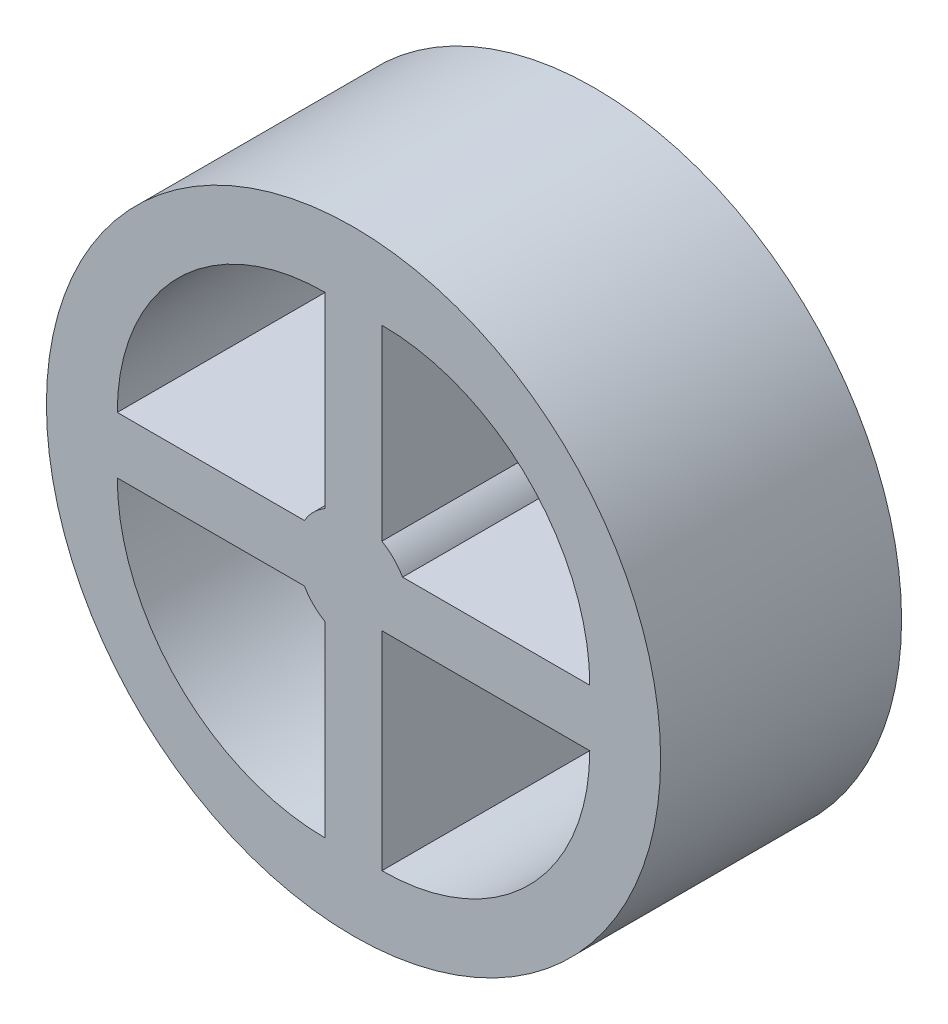
ISO-10303-21;
HEADER;
FILE_DESCRIPTION(('STEP AP214'),'2;1');
FILE_NAME('part.step','',(''),(''),'','','');
FILE_SCHEMA(('AUTOMOTIVE_DESIGN { 1 0 10303 214 1 1 1 1 }'));
ENDSEC;
DATA;
#1=APPLICATION_CONTEXT('core data for automotive mechanical design processes');
#2=APPLICATION_PROTOCOL_DEFINITION('international standard','automotive_design',2000,#1);
#3=PRODUCT_CONTEXT('',#1,'mechanical');
#4=PRODUCT('Part','Part','',(#3));
#5=PRODUCT_RELATED_PRODUCT_CATEGORY('part','',(#4));
#6=PRODUCT_DEFINITION_FORMATION('','',#4);
#7=PRODUCT_DEFINITION_CONTEXT('part definition',#1,'design');
#8=PRODUCT_DEFINITION('design','',#6,#7);
#9=PRODUCT_DEFINITION_SHAPE('','',#8);
#10=(LENGTH_UNIT() NAMED_UNIT(*) SI_UNIT(.MILLI.,.METRE.));
#11=(NAMED_UNIT(*) PLANE_ANGLE_UNIT() SI_UNIT($,.RADIAN.));
#12=(NAMED_UNIT(*) SI_UNIT($,.STERADIAN.) SOLID_ANGLE_UNIT());
#13=UNCERTAINTY_MEASURE_WITH_UNIT(LENGTH_MEASURE(1.E-05),#10,'distance_accuracy_value','');
#14=(GEOMETRIC_REPRESENTATION_CONTEXT(3) GLOBAL_UNCERTAINTY_ASSIGNED_CONTEXT((#13)) GLOBAL_UNIT_ASSIGNED_CONTEXT((#10,
#11,#12)) REPRESENTATION_CONTEXT('',''));
#15=CARTESIAN_POINT('',(0.,0.,0.));
#16=DIRECTION('',(0.,0.,1.));
#17=DIRECTION('',(1.,0.,0.));
#18=AXIS2_PLACEMENT_3D('',#15,#16,#17);
#19=CARTESIAN_POINT('',(0.,0.,255.));
#20=DIRECTION('',(0.,0.,1.));
#21=DIRECTION('',(1.,0.,0.));
#22=AXIS2_PLACEMENT_3D('',#19,#20,#21);
#23=PLANE('',#22);
#24=CARTESIAN_POINT('',(0.,0.,255.));
#25=DIRECTION('',(0.,0.,1.));
#26=DIRECTION('',(1.,0.,0.));
#27=AXIS2_PLACEMENT_3D('',#24,#25,#26);
#28=CIRCLE('',#27,325.);
#29=CARTESIAN_POINT('',(325.,0.,255.));
#30=VERTEX_POINT('',#29);
#31=EDGE_CURVE('E11',#30,#30,#28,.T.);
#32=ORIENTED_EDGE('',*,*,#31,.T.);
#33=EDGE_LOOP('',(#32));
#34=FACE_BOUND('',#33,.T.);
#35=DIRECTION('',(0.,-1.,0.));
#36=VECTOR('',#35,1.);
#37=CARTESIAN_POINT('',(30.,250.,255.));
#38=LINE('',#37,#36);
#39=CARTESIAN_POINT('',(30.,250.,255.));
#40=VERTEX_POINT('',#39);
#41=CARTESIAN_POINT('',(30.,51.9615242270663,255.));
#42=VERTEX_POINT('',#41);
#43=EDGE_CURVE('E231',#40,#42,#38,.T.);
#44=ORIENTED_EDGE('',*,*,#43,.F.);
#45=CARTESIAN_POINT('',(30.,30.,255.));
#46=DIRECTION('',(0.,0.,1.));
#47=DIRECTION('',(-1.,0.,0.));
#48=AXIS2_PLACEMENT_3D('',#45,#46,#47);
#49=CIRCLE('',#48,220.);
#50=CARTESIAN_POINT('',(250.,30.,255.));
#51=VERTEX_POINT('',#50);
#52=EDGE_CURVE('E229',#51,#40,#49,.T.);
#53=ORIENTED_EDGE('',*,*,#52,.F.);
#54=DIRECTION('',(1.,0.,0.));
#55=VECTOR('',#54,1.);
#56=CARTESIAN_POINT('',(51.9615242270663,30.,255.));
#57=LINE('',#56,#55);
#58=CARTESIAN_POINT('',(51.9615242270663,30.,255.));
#59=VERTEX_POINT('',#58);
#60=EDGE_CURVE('E237',#59,#51,#57,.T.);
#61=ORIENTED_EDGE('',*,*,#60,.F.);
#62=CARTESIAN_POINT('',(0.,0.,255.));
#63=DIRECTION('',(0.,0.,-1.));
#64=DIRECTION('',(1.,0.,0.));
#65=AXIS2_PLACEMENT_3D('',#62,#63,#64);
#66=CIRCLE('',#65,60.);
#67=EDGE_CURVE('E234',#42,#59,#66,.T.);
#68=ORIENTED_EDGE('',*,*,#67,.F.);
#69=EDGE_LOOP('',(#44,#53,#61,#68));
#70=FACE_BOUND('',#69,.T.);
#71=DIRECTION('',(0.,1.,0.));
#72=VECTOR('',#71,1.);
#73=CARTESIAN_POINT('',(-30.,250.,255.));
#74=LINE('',#73,#72);
#75=CARTESIAN_POINT('',(-30.,51.9615242270663,255.));
#76=VERTEX_POINT('',#75);
#77=CARTESIAN_POINT('',(-30.,250.,255.));
#78=VERTEX_POINT('',#77);
#79=EDGE_CURVE('E200',#76,#78,#74,.T.);
#80=ORIENTED_EDGE('',*,*,#79,.F.);
#81=CARTESIAN_POINT('',(0.,0.,255.));
#82=DIRECTION('',(0.,0.,-1.));
#83=DIRECTION('',(1.,0.,0.));
#84=AXIS2_PLACEMENT_3D('',#81,#82,#83);
#85=CIRCLE('',#84,60.);
#86=CARTESIAN_POINT('',(-51.9615242270663,30.,255.));
#87=VERTEX_POINT('',#86);
#88=EDGE_CURVE('E198',#87,#76,#85,.T.);
#89=ORIENTED_EDGE('',*,*,#88,.F.);
#90=DIRECTION('',(1.,0.,0.));
#91=VECTOR('',#90,1.);
#92=CARTESIAN_POINT('',(-51.9615242270663,30.,255.));
#93=LINE('',#92,#91);
#94=CARTESIAN_POINT('',(-250.,30.,255.));
#95=VERTEX_POINT('',#94);
#96=EDGE_CURVE('E206',#95,#87,#93,.T.);
#97=ORIENTED_EDGE('',*,*,#96,.F.);
#98=CARTESIAN_POINT('',(-30.,30.,255.));
#99=DIRECTION('',(0.,0.,1.));
#100=DIRECTION('',(1.,0.,0.));
#101=AXIS2_PLACEMENT_3D('',#98,#99,#100);
#102=CIRCLE('',#101,220.);
#103=EDGE_CURVE('E203',#78,#95,#102,.T.);
#104=ORIENTED_EDGE('',*,*,#103,.F.);
#105=EDGE_LOOP('',(#80,#89,#97,#104));
#106=FACE_BOUND('',#105,.T.);
#107=DIRECTION('',(0.,1.,0.));
#108=VECTOR('',#107,1.);
#109=CARTESIAN_POINT('',(-30.0000000000001,-51.9615242270663,255.));
#110=LINE('',#109,#108);
#111=CARTESIAN_POINT('',(-30.,-250.,255.));
#112=VERTEX_POINT('',#111);
#113=CARTESIAN_POINT('',(-30.0000000000001,-51.9615242270663,255.));
#114=VERTEX_POINT('',#113);
#115=EDGE_CURVE('E169',#112,#114,#110,.T.);
#116=ORIENTED_EDGE('',*,*,#115,.F.);
#117=CARTESIAN_POINT('',(-30.0000000000001,-30.,255.));
#118=DIRECTION('',(0.,0.,1.));
#119=DIRECTION('',(-1.,0.,0.));
#120=AXIS2_PLACEMENT_3D('',#117,#118,#119);
#121=CIRCLE('',#120,220.);
#122=CARTESIAN_POINT('',(-250.,-30.,255.));
#123=VERTEX_POINT('',#122);
#124=EDGE_CURVE('E167',#123,#112,#121,.T.);
#125=ORIENTED_EDGE('',*,*,#124,.F.);
#126=DIRECTION('',(-1.,0.,0.));
#127=VECTOR('',#126,1.);
#128=CARTESIAN_POINT('',(-250.,-30.,255.));
#129=LINE('',#128,#127);
#130=CARTESIAN_POINT('',(-51.9615242270663,-30.,255.));
#131=VERTEX_POINT('',#130);
#132=EDGE_CURVE('E175',#131,#123,#129,.T.);
#133=ORIENTED_EDGE('',*,*,#132,.F.);
#134=CARTESIAN_POINT('',(0.,0.,255.));
#135=DIRECTION('',(0.,0.,-1.));
#136=DIRECTION('',(1.,0.,0.));
#137=AXIS2_PLACEMENT_3D('',#134,#135,#136);
#138=CIRCLE('',#137,60.);
#139=EDGE_CURVE('E172',#114,#131,#138,.T.);
#140=ORIENTED_EDGE('',*,*,#139,.F.);
#141=EDGE_LOOP('',(#116,#125,#133,#140));
#142=FACE_BOUND('',#141,.T.);
#143=CARTESIAN_POINT('',(30.0000000000006,-30.0000000000006,255.));
#144=DIRECTION('',(0.,0.,1.));
#145=DIRECTION('',(-1.,0.,0.));
#146=AXIS2_PLACEMENT_3D('',#143,#144,#145);
#147=CIRCLE('',#146,220.);
#148=CARTESIAN_POINT('',(30.0000000000006,-250.,255.));
#149=VERTEX_POINT('',#148);
#150=CARTESIAN_POINT('',(250.000000000001,-30.,255.));
#151=VERTEX_POINT('',#150);
#152=EDGE_CURVE('E148',#149,#151,#147,.T.);
#153=ORIENTED_EDGE('',*,*,#152,.F.);
#154=DIRECTION('',(0.,-1.,0.));
#155=VECTOR('',#154,1.);
#156=CARTESIAN_POINT('',(30.0000000000006,-30.0000000000006,255.));
#157=LINE('',#156,#155);
#158=CARTESIAN_POINT('',(30.0000000000006,-30.0000000000006,255.));
#159=VERTEX_POINT('',#158);
#160=EDGE_CURVE('E140',#159,#149,#157,.T.);
#161=ORIENTED_EDGE('',*,*,#160,.F.);
#162=DIRECTION('',(-1.,0.,0.));
#163=VECTOR('',#162,1.);
#164=CARTESIAN_POINT('',(30.0000000000006,-30.0000000000006,255.));
#165=LINE('',#164,#163);
#166=EDGE_CURVE('E157',#151,#159,#165,.T.);
#167=ORIENTED_EDGE('',*,*,#166,.F.);
#168=EDGE_LOOP('',(#153,#161,#167));
#169=FACE_BOUND('',#168,.T.);
#170=ADVANCED_FACE('F33',(#34,#70,#106,#142,#169),#23,.T.);
#171=CARTESIAN_POINT('',(0.,0.,0.));
#172=DIRECTION('',(0.,0.,1.));
#173=DIRECTION('',(1.,0.,0.));
#174=AXIS2_PLACEMENT_3D('',#171,#172,#173);
#175=PLANE('',#174);
#176=CARTESIAN_POINT('',(-30.0000000000001,-30.,0.));
#177=DIRECTION('',(0.,0.,1.));
#178=DIRECTION('',(-1.,0.,0.));
#179=AXIS2_PLACEMENT_3D('',#176,#177,#178);
#180=CIRCLE('',#179,220.);
#181=CARTESIAN_POINT('',(-250.,-30.,0.));
#182=VERTEX_POINT('',#181);
#183=CARTESIAN_POINT('',(-30.,-250.,0.));
#184=VERTEX_POINT('',#183);
#185=EDGE_CURVE('E155',#182,#184,#180,.T.);
#186=ORIENTED_EDGE('',*,*,#185,.T.);
#187=DIRECTION('',(0.,1.,0.));
#188=VECTOR('',#187,1.);
#189=CARTESIAN_POINT('',(-30.0000000000001,-51.9615242270663,0.));
#190=LINE('',#189,#188);
#191=CARTESIAN_POINT('',(-30.0000000000001,-51.9615242270663,0.));
#192=VERTEX_POINT('',#191);
#193=EDGE_CURVE('E180',#184,#192,#190,.T.);
#194=ORIENTED_EDGE('',*,*,#193,.T.);
#195=CARTESIAN_POINT('',(0.,0.,0.));
#196=DIRECTION('',(0.,0.,-1.));
#197=DIRECTION('',(1.,0.,0.));
#198=AXIS2_PLACEMENT_3D('',#195,#196,#197);
#199=CIRCLE('',#198,60.);
#200=CARTESIAN_POINT('',(-51.9615242270663,-30.,0.));
#201=VERTEX_POINT('',#200);
#202=EDGE_CURVE('E183',#192,#201,#199,.T.);
#203=ORIENTED_EDGE('',*,*,#202,.T.);
#204=DIRECTION('',(-1.,0.,0.));
#205=VECTOR('',#204,1.);
#206=CARTESIAN_POINT('',(-250.,-30.,0.));
#207=LINE('',#206,#205);
#208=EDGE_CURVE('E170',#201,#182,#207,.T.);
#209=ORIENTED_EDGE('',*,*,#208,.T.);
#210=EDGE_LOOP('',(#186,#194,#203,#209));
#211=FACE_BOUND('',#210,.T.);
#212=CARTESIAN_POINT('',(30.,30.,0.));
#213=DIRECTION('',(0.,0.,1.));
#214=DIRECTION('',(-1.,0.,0.));
#215=AXIS2_PLACEMENT_3D('',#212,#213,#214);
#216=CIRCLE('',#215,220.);
#217=CARTESIAN_POINT('',(250.,30.,0.));
#218=VERTEX_POINT('',#217);
#219=CARTESIAN_POINT('',(30.,250.,0.));
#220=VERTEX_POINT('',#219);
#221=EDGE_CURVE('E228',#218,#220,#216,.T.);
#222=ORIENTED_EDGE('',*,*,#221,.T.);
#223=DIRECTION('',(0.,-1.,0.));
#224=VECTOR('',#223,1.);
#225=CARTESIAN_POINT('',(30.,250.,0.));
#226=LINE('',#225,#224);
#227=CARTESIAN_POINT('',(30.,51.9615242270663,0.));
#228=VERTEX_POINT('',#227);
#229=EDGE_CURVE('E242',#220,#228,#226,.T.);
#230=ORIENTED_EDGE('',*,*,#229,.T.);
#231=CARTESIAN_POINT('',(0.,0.,0.));
#232=DIRECTION('',(0.,0.,-1.));
#233=DIRECTION('',(1.,0.,0.));
#234=AXIS2_PLACEMENT_3D('',#231,#232,#233);
#235=CIRCLE('',#234,60.);
#236=CARTESIAN_POINT('',(51.9615242270663,30.,0.));
#237=VERTEX_POINT('',#236);
#238=EDGE_CURVE('E245',#228,#237,#235,.T.);
#239=ORIENTED_EDGE('',*,*,#238,.T.);
#240=DIRECTION('',(1.,0.,0.));
#241=VECTOR('',#240,1.);
#242=CARTESIAN_POINT('',(51.9615242270663,30.,0.));
#243=LINE('',#242,#241);
#244=EDGE_CURVE('E232',#237,#218,#243,.T.);
#245=ORIENTED_EDGE('',*,*,#244,.T.);
#246=EDGE_LOOP('',(#222,#230,#239,#245));
#247=FACE_BOUND('',#246,.T.);
#248=CARTESIAN_POINT('',(0.,0.,0.));
#249=DIRECTION('',(0.,0.,1.));
#250=DIRECTION('',(1.,0.,0.));
#251=AXIS2_PLACEMENT_3D('',#248,#249,#250);
#252=CIRCLE('',#251,325.);
#253=CARTESIAN_POINT('',(325.,0.,0.));
#254=VERTEX_POINT('',#253);
#255=EDGE_CURVE('E37',#254,#254,#252,.T.);
#256=ORIENTED_EDGE('',*,*,#255,.F.);
#257=EDGE_LOOP('',(#256));
#258=FACE_BOUND('',#257,.T.);
#259=CARTESIAN_POINT('',(0.,0.,0.));
#260=DIRECTION('',(0.,0.,-1.));
#261=DIRECTION('',(1.,0.,0.));
#262=AXIS2_PLACEMENT_3D('',#259,#260,#261);
#263=CIRCLE('',#262,60.);
#264=CARTESIAN_POINT('',(-51.9615242270663,30.,0.));
#265=VERTEX_POINT('',#264);
#266=CARTESIAN_POINT('',(-30.,51.9615242270663,0.));
#267=VERTEX_POINT('',#266);
#268=EDGE_CURVE('E197',#265,#267,#263,.T.);
#269=ORIENTED_EDGE('',*,*,#268,.T.);
#270=DIRECTION('',(0.,1.,0.));
#271=VECTOR('',#270,1.);
#272=CARTESIAN_POINT('',(-30.,250.,0.));
#273=LINE('',#272,#271);
#274=CARTESIAN_POINT('',(-30.,250.,0.));
#275=VERTEX_POINT('',#274);
#276=EDGE_CURVE('E211',#267,#275,#273,.T.);
#277=ORIENTED_EDGE('',*,*,#276,.T.);
#278=CARTESIAN_POINT('',(-30.,30.,0.));
#279=DIRECTION('',(0.,0.,1.));
#280=DIRECTION('',(1.,0.,0.));
#281=AXIS2_PLACEMENT_3D('',#278,#279,#280);
#282=CIRCLE('',#281,220.);
#283=CARTESIAN_POINT('',(-250.,30.,0.));
#284=VERTEX_POINT('',#283);
#285=EDGE_CURVE('E214',#275,#284,#282,.T.);
#286=ORIENTED_EDGE('',*,*,#285,.T.);
#287=DIRECTION('',(1.,0.,0.));
#288=VECTOR('',#287,1.);
#289=CARTESIAN_POINT('',(-51.9615242270663,30.,0.));
#290=LINE('',#289,#288);
#291=EDGE_CURVE('E201',#284,#265,#290,.T.);
#292=ORIENTED_EDGE('',*,*,#291,.T.);
#293=EDGE_LOOP('',(#269,#277,#286,#292));
#294=FACE_BOUND('',#293,.T.);
#295=DIRECTION('',(0.,-1.,0.));
#296=VECTOR('',#295,1.);
#297=CARTESIAN_POINT('',(30.0000000000006,-30.0000000000006,0.));
#298=LINE('',#297,#296);
#299=CARTESIAN_POINT('',(30.0000000000006,-30.0000000000006,0.));
#300=VERTEX_POINT('',#299);
#301=CARTESIAN_POINT('',(30.0000000000006,-250.,0.));
#302=VERTEX_POINT('',#301);
#303=EDGE_CURVE('E56',#300,#302,#298,.T.);
#304=ORIENTED_EDGE('',*,*,#303,.T.);
#305=CARTESIAN_POINT('',(30.0000000000006,-30.0000000000006,0.));
#306=DIRECTION('',(0.,0.,1.));
#307=DIRECTION('',(-1.,0.,0.));
#308=AXIS2_PLACEMENT_3D('',#305,#306,#307);
#309=CIRCLE('',#308,220.);
#310=CARTESIAN_POINT('',(250.000000000001,-30.,0.));
#311=VERTEX_POINT('',#310);
#312=EDGE_CURVE('E154',#302,#311,#309,.T.);
#313=ORIENTED_EDGE('',*,*,#312,.T.);
#314=DIRECTION('',(-1.,0.,0.));
#315=VECTOR('',#314,1.);
#316=CARTESIAN_POINT('',(30.0000000000006,-30.0000000000006,0.));
#317=LINE('',#316,#315);
#318=EDGE_CURVE('E149',#311,#300,#317,.T.);
#319=ORIENTED_EDGE('',*,*,#318,.T.);
#320=EDGE_LOOP('',(#304,#313,#319));
#321=FACE_BOUND('',#320,.T.);
#322=ADVANCED_FACE('F264',(#211,#247,#258,#294,#321),#175,.F.);
#323=CARTESIAN_POINT('',(0.,0.,255.));
#324=DIRECTION('',(0.,0.,-1.));
#325=DIRECTION('',(-1.,0.,0.));
#326=AXIS2_PLACEMENT_3D('',#323,#324,#325);
#327=CYLINDRICAL_SURFACE('',#326,325.);
#328=ORIENTED_EDGE('',*,*,#31,.F.);
#329=EDGE_LOOP('',(#328));
#330=FACE_BOUND('',#329,.T.);
#331=ORIENTED_EDGE('',*,*,#255,.T.);
#332=EDGE_LOOP('',(#331));
#333=FACE_BOUND('',#332,.T.);
#334=ADVANCED_FACE('F35',(#330,#333),#327,.T.);
#335=CARTESIAN_POINT('',(30.,30.,255.));
#336=DIRECTION('',(0.,0.,-1.));
#337=DIRECTION('',(-1.,0.,0.));
#338=AXIS2_PLACEMENT_3D('',#335,#336,#337);
#339=CYLINDRICAL_SURFACE('',#338,220.);
#340=ORIENTED_EDGE('',*,*,#221,.F.);
#341=DIRECTION('',(0.,0.,-1.));
#342=VECTOR('',#341,1.);
#343=CARTESIAN_POINT('',(250.,30.,255.));
#344=LINE('',#343,#342);
#345=EDGE_CURVE('E239',#51,#218,#344,.T.);
#346=ORIENTED_EDGE('',*,*,#345,.F.);
#347=ORIENTED_EDGE('',*,*,#52,.T.);
#348=DIRECTION('',(0.,0.,-1.));
#349=VECTOR('',#348,1.);
#350=CARTESIAN_POINT('',(30.,250.,255.));
#351=LINE('',#350,#349);
#352=EDGE_CURVE('E256',#40,#220,#351,.T.);
#353=ORIENTED_EDGE('',*,*,#352,.T.);
#354=EDGE_LOOP('',(#340,#346,#347,#353));
#355=FACE_BOUND('',#354,.T.);
#356=ADVANCED_FACE('F283',(#355),#339,.F.);
#357=CARTESIAN_POINT('',(30.,250.,255.));
#358=DIRECTION('',(1.,0.,0.));
#359=DIRECTION('',(0.,1.,0.));
#360=AXIS2_PLACEMENT_3D('',#357,#358,#359);
#361=PLANE('',#360);
#362=ORIENTED_EDGE('',*,*,#229,.F.);
#363=ORIENTED_EDGE('',*,*,#352,.F.);
#364=ORIENTED_EDGE('',*,*,#43,.T.);
#365=DIRECTION('',(0.,0.,-1.));
#366=VECTOR('',#365,1.);
#367=CARTESIAN_POINT('',(30.,51.9615242270663,255.));
#368=LINE('',#367,#366);
#369=EDGE_CURVE('E254',#42,#228,#368,.T.);
#370=ORIENTED_EDGE('',*,*,#369,.T.);
#371=EDGE_LOOP('',(#362,#363,#364,#370));
#372=FACE_BOUND('',#371,.T.);
#373=ADVANCED_FACE('F286',(#372),#361,.T.);
#374=CARTESIAN_POINT('',(0.,0.,255.));
#375=DIRECTION('',(0.,0.,-1.));
#376=DIRECTION('',(-1.,0.,0.));
#377=AXIS2_PLACEMENT_3D('',#374,#375,#376);
#378=CYLINDRICAL_SURFACE('',#377,60.);
#379=ORIENTED_EDGE('',*,*,#238,.F.);
#380=ORIENTED_EDGE('',*,*,#369,.F.);
#381=ORIENTED_EDGE('',*,*,#67,.T.);
#382=DIRECTION('',(0.,0.,-1.));
#383=VECTOR('',#382,1.);
#384=CARTESIAN_POINT('',(51.9615242270663,30.,255.));
#385=LINE('',#384,#383);
#386=EDGE_CURVE('E252',#59,#237,#385,.T.);
#387=ORIENTED_EDGE('',*,*,#386,.T.);
#388=EDGE_LOOP('',(#379,#380,#381,#387));
#389=FACE_BOUND('',#388,.T.);
#390=ADVANCED_FACE('F289',(#389),#378,.T.);
#391=CARTESIAN_POINT('',(51.9615242270663,30.,255.));
#392=DIRECTION('',(0.,1.,0.));
#393=DIRECTION('',(-1.,0.,0.));
#394=AXIS2_PLACEMENT_3D('',#391,#392,#393);
#395=PLANE('',#394);
#396=ORIENTED_EDGE('',*,*,#244,.F.);
#397=ORIENTED_EDGE('',*,*,#386,.F.);
#398=ORIENTED_EDGE('',*,*,#60,.T.);
#399=ORIENTED_EDGE('',*,*,#345,.T.);
#400=EDGE_LOOP('',(#396,#397,#398,#399));
#401=FACE_BOUND('',#400,.T.);
#402=ADVANCED_FACE('F293',(#401),#395,.T.);
#403=CARTESIAN_POINT('',(0.,0.,255.));
#404=DIRECTION('',(0.,0.,-1.));
#405=DIRECTION('',(-1.,0.,0.));
#406=AXIS2_PLACEMENT_3D('',#403,#404,#405);
#407=CYLINDRICAL_SURFACE('',#406,60.);
#408=ORIENTED_EDGE('',*,*,#268,.F.);
#409=DIRECTION('',(0.,0.,-1.));
#410=VECTOR('',#409,1.);
#411=CARTESIAN_POINT('',(-51.9615242270663,30.,255.));
#412=LINE('',#411,#410);
#413=EDGE_CURVE('E208',#87,#265,#412,.T.);
#414=ORIENTED_EDGE('',*,*,#413,.F.);
#415=ORIENTED_EDGE('',*,*,#88,.T.);
#416=DIRECTION('',(0.,0.,-1.));
#417=VECTOR('',#416,1.);
#418=CARTESIAN_POINT('',(-30.,51.9615242270663,255.));
#419=LINE('',#418,#417);
#420=EDGE_CURVE('E225',#76,#267,#419,.T.);
#421=ORIENTED_EDGE('',*,*,#420,.T.);
#422=EDGE_LOOP('',(#408,#414,#415,#421));
#423=FACE_BOUND('',#422,.T.);
#424=ADVANCED_FACE('F297',(#423),#407,.T.);
#425=CARTESIAN_POINT('',(-30.,250.,255.));
#426=DIRECTION('',(-1.,0.,0.));
#427=DIRECTION('',(0.,-1.,0.));
#428=AXIS2_PLACEMENT_3D('',#425,#426,#427);
#429=PLANE('',#428);
#430=ORIENTED_EDGE('',*,*,#276,.F.);
#431=ORIENTED_EDGE('',*,*,#420,.F.);
#432=ORIENTED_EDGE('',*,*,#79,.T.);
#433=DIRECTION('',(0.,0.,-1.));
#434=VECTOR('',#433,1.);
#435=CARTESIAN_POINT('',(-30.,250.,255.));
#436=LINE('',#435,#434);
#437=EDGE_CURVE('E223',#78,#275,#436,.T.);
#438=ORIENTED_EDGE('',*,*,#437,.T.);
#439=EDGE_LOOP('',(#430,#431,#432,#438));
#440=FACE_BOUND('',#439,.T.);
#441=ADVANCED_FACE('F301',(#440),#429,.T.);
#442=CARTESIAN_POINT('',(-30.,30.,255.));
#443=DIRECTION('',(0.,0.,-1.));
#444=DIRECTION('',(-1.,0.,0.));
#445=AXIS2_PLACEMENT_3D('',#442,#443,#444);
#446=CYLINDRICAL_SURFACE('',#445,220.);
#447=ORIENTED_EDGE('',*,*,#285,.F.);
#448=ORIENTED_EDGE('',*,*,#437,.F.);
#449=ORIENTED_EDGE('',*,*,#103,.T.);
#450=DIRECTION('',(0.,0.,-1.));
#451=VECTOR('',#450,1.);
#452=CARTESIAN_POINT('',(-250.,30.,255.));
#453=LINE('',#452,#451);
#454=EDGE_CURVE('E221',#95,#284,#453,.T.);
#455=ORIENTED_EDGE('',*,*,#454,.T.);
#456=EDGE_LOOP('',(#447,#448,#449,#455));
#457=FACE_BOUND('',#456,.T.);
#458=ADVANCED_FACE('F305',(#457),#446,.F.);
#459=CARTESIAN_POINT('',(-51.9615242270663,30.,255.));
#460=DIRECTION('',(0.,1.,0.));
#461=DIRECTION('',(-1.,0.,0.));
#462=AXIS2_PLACEMENT_3D('',#459,#460,#461);
#463=PLANE('',#462);
#464=ORIENTED_EDGE('',*,*,#291,.F.);
#465=ORIENTED_EDGE('',*,*,#454,.F.);
#466=ORIENTED_EDGE('',*,*,#96,.T.);
#467=ORIENTED_EDGE('',*,*,#413,.T.);
#468=EDGE_LOOP('',(#464,#465,#466,#467));
#469=FACE_BOUND('',#468,.T.);
#470=ADVANCED_FACE('F309',(#469),#463,.T.);
#471=CARTESIAN_POINT('',(-30.0000000000001,-30.,255.));
#472=DIRECTION('',(0.,0.,-1.));
#473=DIRECTION('',(-1.,0.,0.));
#474=AXIS2_PLACEMENT_3D('',#471,#472,#473);
#475=CYLINDRICAL_SURFACE('',#474,220.);
#476=ORIENTED_EDGE('',*,*,#185,.F.);
#477=DIRECTION('',(0.,0.,-1.));
#478=VECTOR('',#477,1.);
#479=CARTESIAN_POINT('',(-250.,-30.,255.));
#480=LINE('',#479,#478);
#481=EDGE_CURVE('E177',#123,#182,#480,.T.);
#482=ORIENTED_EDGE('',*,*,#481,.F.);
#483=ORIENTED_EDGE('',*,*,#124,.T.);
#484=DIRECTION('',(0.,0.,-1.));
#485=VECTOR('',#484,1.);
#486=CARTESIAN_POINT('',(-30.,-250.,255.));
#487=LINE('',#486,#485);
#488=EDGE_CURVE('E194',#112,#184,#487,.T.);
#489=ORIENTED_EDGE('',*,*,#488,.T.);
#490=EDGE_LOOP('',(#476,#482,#483,#489));
#491=FACE_BOUND('',#490,.T.);
#492=ADVANCED_FACE('F313',(#491),#475,.F.);
#493=CARTESIAN_POINT('',(-30.0000000000001,-51.9615242270663,255.));
#494=DIRECTION('',(-1.,0.,0.));
#495=DIRECTION('',(0.,-1.,0.));
#496=AXIS2_PLACEMENT_3D('',#493,#494,#495);
#497=PLANE('',#496);
#498=ORIENTED_EDGE('',*,*,#193,.F.);
#499=ORIENTED_EDGE('',*,*,#488,.F.);
#500=ORIENTED_EDGE('',*,*,#115,.T.);
#501=DIRECTION('',(0.,0.,-1.));
#502=VECTOR('',#501,1.);
#503=CARTESIAN_POINT('',(-30.0000000000001,-51.9615242270663,255.));
#504=LINE('',#503,#502);
#505=EDGE_CURVE('E192',#114,#192,#504,.T.);
#506=ORIENTED_EDGE('',*,*,#505,.T.);
#507=EDGE_LOOP('',(#498,#499,#500,#506));
#508=FACE_BOUND('',#507,.T.);
#509=ADVANCED_FACE('F317',(#508),#497,.T.);
#510=CARTESIAN_POINT('',(0.,0.,255.));
#511=DIRECTION('',(0.,0.,-1.));
#512=DIRECTION('',(-1.,0.,0.));
#513=AXIS2_PLACEMENT_3D('',#510,#511,#512);
#514=CYLINDRICAL_SURFACE('',#513,60.);
#515=ORIENTED_EDGE('',*,*,#202,.F.);
#516=ORIENTED_EDGE('',*,*,#505,.F.);
#517=ORIENTED_EDGE('',*,*,#139,.T.);
#518=DIRECTION('',(0.,0.,-1.));
#519=VECTOR('',#518,1.);
#520=CARTESIAN_POINT('',(-51.9615242270663,-30.,255.));
#521=LINE('',#520,#519);
#522=EDGE_CURVE('E190',#131,#201,#521,.T.);
#523=ORIENTED_EDGE('',*,*,#522,.T.);
#524=EDGE_LOOP('',(#515,#516,#517,#523));
#525=FACE_BOUND('',#524,.T.);
#526=ADVANCED_FACE('F321',(#525),#514,.T.);
#527=CARTESIAN_POINT('',(-250.,-30.,255.));
#528=DIRECTION('',(0.,-1.,0.));
#529=DIRECTION('',(0.,0.,-1.));
#530=AXIS2_PLACEMENT_3D('',#527,#528,#529);
#531=PLANE('',#530);
#532=ORIENTED_EDGE('',*,*,#208,.F.);
#533=ORIENTED_EDGE('',*,*,#522,.F.);
#534=ORIENTED_EDGE('',*,*,#132,.T.);
#535=ORIENTED_EDGE('',*,*,#481,.T.);
#536=EDGE_LOOP('',(#532,#533,#534,#535));
#537=FACE_BOUND('',#536,.T.);
#538=ADVANCED_FACE('F325',(#537),#531,.T.);
#539=CARTESIAN_POINT('',(30.0000000000006,-30.0000000000006,255.));
#540=DIRECTION('',(1.,0.,0.));
#541=DIRECTION('',(0.,1.,0.));
#542=AXIS2_PLACEMENT_3D('',#539,#540,#541);
#543=PLANE('',#542);
#544=ORIENTED_EDGE('',*,*,#303,.F.);
#545=DIRECTION('',(0.,0.,-1.));
#546=VECTOR('',#545,1.);
#547=CARTESIAN_POINT('',(30.0000000000006,-30.0000000000006,255.));
#548=LINE('',#547,#546);
#549=EDGE_CURVE('E144',#159,#300,#548,.T.);
#550=ORIENTED_EDGE('',*,*,#549,.F.);
#551=ORIENTED_EDGE('',*,*,#160,.T.);
#552=DIRECTION('',(0.,0.,-1.));
#553=VECTOR('',#552,1.);
#554=CARTESIAN_POINT('',(30.0000000000006,-250.,255.));
#555=LINE('',#554,#553);
#556=EDGE_CURVE('E143',#149,#302,#555,.T.);
#557=ORIENTED_EDGE('',*,*,#556,.T.);
#558=EDGE_LOOP('',(#544,#550,#551,#557));
#559=FACE_BOUND('',#558,.T.);
#560=ADVANCED_FACE('F142',(#559),#543,.T.);
#561=CARTESIAN_POINT('',(30.0000000000006,-30.0000000000006,255.));
#562=DIRECTION('',(0.,0.,-1.));
#563=DIRECTION('',(-1.,0.,0.));
#564=AXIS2_PLACEMENT_3D('',#561,#562,#563);
#565=CYLINDRICAL_SURFACE('',#564,220.);
#566=ORIENTED_EDGE('',*,*,#312,.F.);
#567=ORIENTED_EDGE('',*,*,#556,.F.);
#568=ORIENTED_EDGE('',*,*,#152,.T.);
#569=DIRECTION('',(0.,0.,-1.));
#570=VECTOR('',#569,1.);
#571=CARTESIAN_POINT('',(250.000000000001,-30.,255.));
#572=LINE('',#571,#570);
#573=EDGE_CURVE('E48',#151,#311,#572,.T.);
#574=ORIENTED_EDGE('',*,*,#573,.T.);
#575=EDGE_LOOP('',(#566,#567,#568,#574));
#576=FACE_BOUND('',#575,.T.);
#577=ADVANCED_FACE('F152',(#576),#565,.F.);
#578=CARTESIAN_POINT('',(30.0000000000006,-30.0000000000006,255.));
#579=DIRECTION('',(0.,-1.,0.));
#580=DIRECTION('',(1.,0.,0.));
#581=AXIS2_PLACEMENT_3D('',#578,#579,#580);
#582=PLANE('',#581);
#583=ORIENTED_EDGE('',*,*,#318,.F.);
#584=ORIENTED_EDGE('',*,*,#573,.F.);
#585=ORIENTED_EDGE('',*,*,#166,.T.);
#586=ORIENTED_EDGE('',*,*,#549,.T.);
#587=EDGE_LOOP('',(#583,#584,#585,#586));
#588=FACE_BOUND('',#587,.T.);
#589=ADVANCED_FACE('F269',(#588),#582,.T.);
#590=CLOSED_SHELL('',(#170,#322,#334,#356,#373,#390,#402,#424,#441,#458,#470,#492,#509,#526,
#538,#560,#577,#589));
#591=MANIFOLD_SOLID_BREP('B2',#590);
#592=ADVANCED_BREP_SHAPE_REPRESENTATION('',(#18,#591),#14);
#593=SHAPE_DEFINITION_REPRESENTATION(#9,#592);
ENDSEC;
END-ISO-10303-21;
